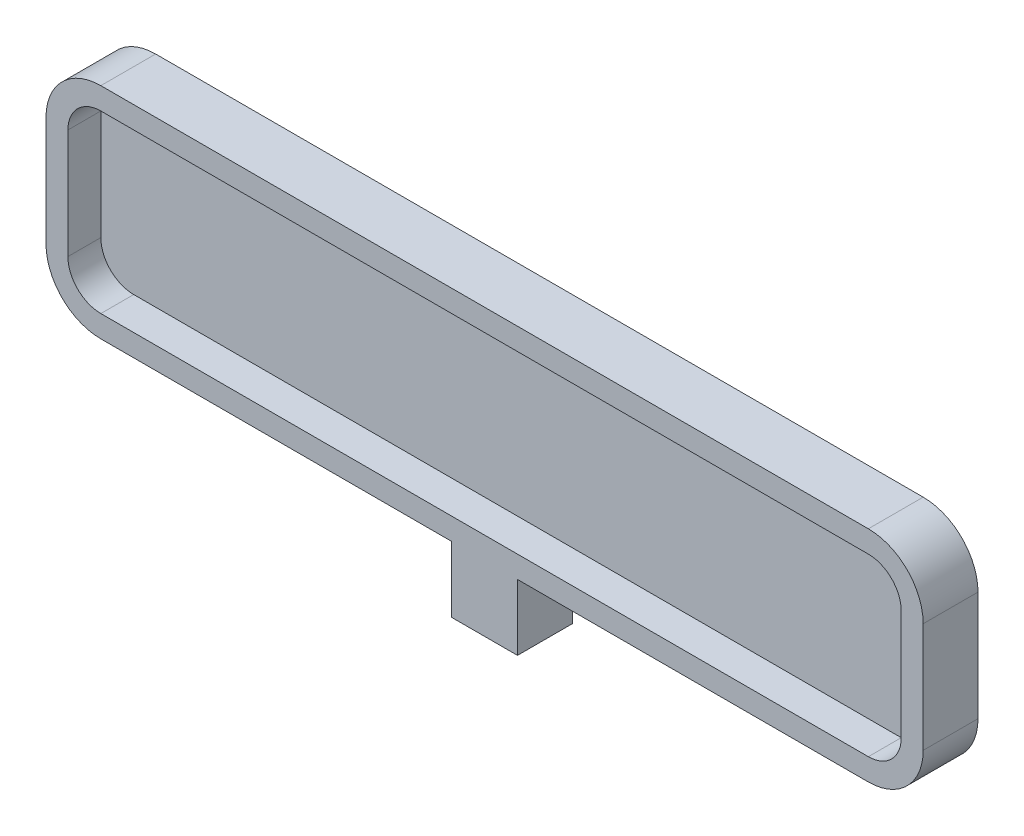
ISO-10303-21;
HEADER;
FILE_DESCRIPTION(('STEP AP214'),'2;1');
FILE_NAME('part.step','',(''),(''),'','','');
FILE_SCHEMA(('AUTOMOTIVE_DESIGN { 1 0 10303 214 1 1 1 1 }'));
ENDSEC;
DATA;
#1=APPLICATION_CONTEXT('core data for automotive mechanical design processes');
#2=APPLICATION_PROTOCOL_DEFINITION('international standard','automotive_design',2000,#1);
#3=PRODUCT_CONTEXT('',#1,'mechanical');
#4=PRODUCT('Part','Part','',(#3));
#5=PRODUCT_RELATED_PRODUCT_CATEGORY('part','',(#4));
#6=PRODUCT_DEFINITION_FORMATION('','',#4);
#7=PRODUCT_DEFINITION_CONTEXT('part definition',#1,'design');
#8=PRODUCT_DEFINITION('design','',#6,#7);
#9=PRODUCT_DEFINITION_SHAPE('','',#8);
#10=(LENGTH_UNIT() NAMED_UNIT(*) SI_UNIT(.MILLI.,.METRE.));
#11=(NAMED_UNIT(*) PLANE_ANGLE_UNIT() SI_UNIT($,.RADIAN.));
#12=(NAMED_UNIT(*) SI_UNIT($,.STERADIAN.) SOLID_ANGLE_UNIT());
#13=UNCERTAINTY_MEASURE_WITH_UNIT(LENGTH_MEASURE(1.E-05),#10,'distance_accuracy_value','');
#14=(GEOMETRIC_REPRESENTATION_CONTEXT(3) GLOBAL_UNCERTAINTY_ASSIGNED_CONTEXT((#13)) GLOBAL_UNIT_ASSIGNED_CONTEXT((#10,
#11,#12)) REPRESENTATION_CONTEXT('',''));
#15=CARTESIAN_POINT('',(0.,0.,0.));
#16=DIRECTION('',(0.,0.,1.));
#17=DIRECTION('',(1.,0.,0.));
#18=AXIS2_PLACEMENT_3D('',#15,#16,#17);
#19=CARTESIAN_POINT('',(-40.,-10.,2.5));
#20=DIRECTION('',(0.,1.,0.));
#21=DIRECTION('',(0.,0.,1.));
#22=AXIS2_PLACEMENT_3D('',#19,#20,#21);
#23=PLANE('',#22);
#24=DIRECTION('',(0.,0.,1.));
#25=VECTOR('',#24,1.);
#26=CARTESIAN_POINT('',(3.,-10.,-2.5));
#27=LINE('',#26,#25);
#28=CARTESIAN_POINT('',(3.,-10.,-2.5));
#29=VERTEX_POINT('',#28);
#30=CARTESIAN_POINT('',(3.,-10.,2.5));
#31=VERTEX_POINT('',#30);
#32=EDGE_CURVE('E199',#29,#31,#27,.T.);
#33=ORIENTED_EDGE('',*,*,#32,.F.);
#34=DIRECTION('',(1.,0.,0.));
#35=VECTOR('',#34,1.);
#36=CARTESIAN_POINT('',(-40.,-10.,-2.5));
#37=LINE('',#36,#35);
#38=CARTESIAN_POINT('',(35.,-10.,-2.5));
#39=VERTEX_POINT('',#38);
#40=EDGE_CURVE('E286',#29,#39,#37,.T.);
#41=ORIENTED_EDGE('',*,*,#40,.T.);
#42=DIRECTION('',(0.,0.,-1.));
#43=VECTOR('',#42,1.);
#44=CARTESIAN_POINT('',(35.,-10.,2.5));
#45=LINE('',#44,#43);
#46=CARTESIAN_POINT('',(35.,-10.,2.5));
#47=VERTEX_POINT('',#46);
#48=EDGE_CURVE('E277',#39,#47,#45,.F.);
#49=ORIENTED_EDGE('',*,*,#48,.T.);
#50=DIRECTION('',(1.,0.,0.));
#51=VECTOR('',#50,1.);
#52=CARTESIAN_POINT('',(-40.,-10.,2.5));
#53=LINE('',#52,#51);
#54=EDGE_CURVE('E53',#31,#47,#53,.T.);
#55=ORIENTED_EDGE('',*,*,#54,.F.);
#56=EDGE_LOOP('',(#33,#41,#49,#55));
#57=FACE_BOUND('',#56,.T.);
#58=ADVANCED_FACE('F38',(#57),#23,.F.);
#59=DIRECTION('',(0.,0.,-1.));
#60=VECTOR('',#59,1.);
#61=CARTESIAN_POINT('',(-3.,-10.,-2.5));
#62=LINE('',#61,#60);
#63=CARTESIAN_POINT('',(-3.,-10.,2.5));
#64=VERTEX_POINT('',#63);
#65=CARTESIAN_POINT('',(-3.,-10.,-2.5));
#66=VERTEX_POINT('',#65);
#67=EDGE_CURVE('E61',#64,#66,#62,.T.);
#68=ORIENTED_EDGE('',*,*,#67,.F.);
#69=CARTESIAN_POINT('',(-35.,-10.,2.5));
#70=VERTEX_POINT('',#69);
#71=EDGE_CURVE('E275',#70,#64,#53,.T.);
#72=ORIENTED_EDGE('',*,*,#71,.F.);
#73=DIRECTION('',(0.,0.,-1.));
#74=VECTOR('',#73,1.);
#75=CARTESIAN_POINT('',(-35.,-10.,2.5));
#76=LINE('',#75,#74);
#77=CARTESIAN_POINT('',(-35.,-10.,-2.5));
#78=VERTEX_POINT('',#77);
#79=EDGE_CURVE('E289',#70,#78,#76,.T.);
#80=ORIENTED_EDGE('',*,*,#79,.T.);
#81=EDGE_CURVE('E270',#78,#66,#37,.T.);
#82=ORIENTED_EDGE('',*,*,#81,.T.);
#83=EDGE_LOOP('',(#68,#72,#80,#82));
#84=FACE_BOUND('',#83,.T.);
#85=ADVANCED_FACE('F341',(#84),#23,.F.);
#86=CARTESIAN_POINT('',(40.,-10.,2.5));
#87=DIRECTION('',(-1.,0.,0.));
#88=DIRECTION('',(0.,0.,1.));
#89=AXIS2_PLACEMENT_3D('',#86,#87,#88);
#90=PLANE('',#89);
#91=DIRECTION('',(0.,1.,0.));
#92=VECTOR('',#91,1.);
#93=CARTESIAN_POINT('',(40.,-10.,2.5));
#94=LINE('',#93,#92);
#95=CARTESIAN_POINT('',(40.,-5.,2.5));
#96=VERTEX_POINT('',#95);
#97=CARTESIAN_POINT('',(40.,5.,2.5));
#98=VERTEX_POINT('',#97);
#99=EDGE_CURVE('E266',#96,#98,#94,.T.);
#100=ORIENTED_EDGE('',*,*,#99,.F.);
#101=DIRECTION('',(0.,0.,-1.));
#102=VECTOR('',#101,1.);
#103=CARTESIAN_POINT('',(40.,-5.,2.5));
#104=LINE('',#103,#102);
#105=CARTESIAN_POINT('',(40.,-5.,-2.5));
#106=VERTEX_POINT('',#105);
#107=EDGE_CURVE('E316',#96,#106,#104,.T.);
#108=ORIENTED_EDGE('',*,*,#107,.T.);
#109=DIRECTION('',(0.,1.,0.));
#110=VECTOR('',#109,1.);
#111=CARTESIAN_POINT('',(40.,-10.,-2.5));
#112=LINE('',#111,#110);
#113=CARTESIAN_POINT('',(40.,5.,-2.5));
#114=VERTEX_POINT('',#113);
#115=EDGE_CURVE('E238',#106,#114,#112,.T.);
#116=ORIENTED_EDGE('',*,*,#115,.T.);
#117=DIRECTION('',(0.,0.,-1.));
#118=VECTOR('',#117,1.);
#119=CARTESIAN_POINT('',(40.,5.,2.5));
#120=LINE('',#119,#118);
#121=EDGE_CURVE('E314',#114,#98,#120,.F.);
#122=ORIENTED_EDGE('',*,*,#121,.T.);
#123=EDGE_LOOP('',(#100,#108,#116,#122));
#124=FACE_BOUND('',#123,.T.);
#125=ADVANCED_FACE('F359',(#124),#90,.F.);
#126=CARTESIAN_POINT('',(-40.,10.,2.5));
#127=DIRECTION('',(0.,-1.,0.));
#128=DIRECTION('',(0.,0.,-1.));
#129=AXIS2_PLACEMENT_3D('',#126,#127,#128);
#130=PLANE('',#129);
#131=DIRECTION('',(-1.,0.,0.));
#132=VECTOR('',#131,1.);
#133=CARTESIAN_POINT('',(-40.,10.,2.5));
#134=LINE('',#133,#132);
#135=CARTESIAN_POINT('',(35.,10.,2.5));
#136=VERTEX_POINT('',#135);
#137=CARTESIAN_POINT('',(-35.,10.,2.5));
#138=VERTEX_POINT('',#137);
#139=EDGE_CURVE('E269',#136,#138,#134,.T.);
#140=ORIENTED_EDGE('',*,*,#139,.F.);
#141=DIRECTION('',(0.,0.,-1.));
#142=VECTOR('',#141,1.);
#143=CARTESIAN_POINT('',(35.,10.,2.5));
#144=LINE('',#143,#142);
#145=CARTESIAN_POINT('',(35.,10.,-2.5));
#146=VERTEX_POINT('',#145);
#147=EDGE_CURVE('E11',#136,#146,#144,.T.);
#148=ORIENTED_EDGE('',*,*,#147,.T.);
#149=DIRECTION('',(-1.,0.,0.));
#150=VECTOR('',#149,1.);
#151=CARTESIAN_POINT('',(-40.,10.,-2.5));
#152=LINE('',#151,#150);
#153=CARTESIAN_POINT('',(-35.,10.,-2.5));
#154=VERTEX_POINT('',#153);
#155=EDGE_CURVE('E280',#146,#154,#152,.T.);
#156=ORIENTED_EDGE('',*,*,#155,.T.);
#157=DIRECTION('',(0.,0.,-1.));
#158=VECTOR('',#157,1.);
#159=CARTESIAN_POINT('',(-35.,10.,2.5));
#160=LINE('',#159,#158);
#161=EDGE_CURVE('E46',#154,#138,#160,.F.);
#162=ORIENTED_EDGE('',*,*,#161,.T.);
#163=EDGE_LOOP('',(#140,#148,#156,#162));
#164=FACE_BOUND('',#163,.T.);
#165=ADVANCED_FACE('F321',(#164),#130,.F.);
#166=CARTESIAN_POINT('',(-40.,-10.,2.5));
#167=DIRECTION('',(1.,0.,0.));
#168=DIRECTION('',(0.,0.,-1.));
#169=AXIS2_PLACEMENT_3D('',#166,#167,#168);
#170=PLANE('',#169);
#171=DIRECTION('',(0.,-1.,0.));
#172=VECTOR('',#171,1.);
#173=CARTESIAN_POINT('',(-40.,-10.,-2.5));
#174=LINE('',#173,#172);
#175=CARTESIAN_POINT('',(-40.,5.,-2.5));
#176=VERTEX_POINT('',#175);
#177=CARTESIAN_POINT('',(-40.,-5.,-2.5));
#178=VERTEX_POINT('',#177);
#179=EDGE_CURVE('E283',#176,#178,#174,.T.);
#180=ORIENTED_EDGE('',*,*,#179,.T.);
#181=DIRECTION('',(0.,0.,-1.));
#182=VECTOR('',#181,1.);
#183=CARTESIAN_POINT('',(-40.,-5.,2.5));
#184=LINE('',#183,#182);
#185=CARTESIAN_POINT('',(-40.,-5.,2.5));
#186=VERTEX_POINT('',#185);
#187=EDGE_CURVE('E304',#178,#186,#184,.F.);
#188=ORIENTED_EDGE('',*,*,#187,.T.);
#189=DIRECTION('',(0.,-1.,0.));
#190=VECTOR('',#189,1.);
#191=CARTESIAN_POINT('',(-40.,-10.,2.5));
#192=LINE('',#191,#190);
#193=CARTESIAN_POINT('',(-40.,5.,2.5));
#194=VERTEX_POINT('',#193);
#195=EDGE_CURVE('E273',#194,#186,#192,.T.);
#196=ORIENTED_EDGE('',*,*,#195,.F.);
#197=DIRECTION('',(0.,0.,-1.));
#198=VECTOR('',#197,1.);
#199=CARTESIAN_POINT('',(-40.,5.,2.5));
#200=LINE('',#199,#198);
#201=EDGE_CURVE('E301',#194,#176,#200,.T.);
#202=ORIENTED_EDGE('',*,*,#201,.T.);
#203=EDGE_LOOP('',(#180,#188,#196,#202));
#204=FACE_BOUND('',#203,.T.);
#205=ADVANCED_FACE('F331',(#204),#170,.F.);
#206=CARTESIAN_POINT('',(0.,0.,2.5));
#207=DIRECTION('',(0.,0.,-1.));
#208=DIRECTION('',(-1.,0.,0.));
#209=AXIS2_PLACEMENT_3D('',#206,#207,#208);
#210=PLANE('',#209);
#211=DIRECTION('',(0.,-1.,0.));
#212=VECTOR('',#211,1.);
#213=CARTESIAN_POINT('',(-38.,0.,2.5));
#214=LINE('',#213,#212);
#215=CARTESIAN_POINT('',(-38.,5.,2.5));
#216=VERTEX_POINT('',#215);
#217=CARTESIAN_POINT('',(-38.,-5.,2.5));
#218=VERTEX_POINT('',#217);
#219=EDGE_CURVE('E258',#216,#218,#214,.T.);
#220=ORIENTED_EDGE('',*,*,#219,.F.);
#221=CARTESIAN_POINT('',(-35.,5.,2.5));
#222=DIRECTION('',(0.,0.,-1.));
#223=DIRECTION('',(-1.,0.,0.));
#224=AXIS2_PLACEMENT_3D('',#221,#222,#223);
#225=CIRCLE('',#224,3.);
#226=CARTESIAN_POINT('',(-35.,8.,2.5));
#227=VERTEX_POINT('',#226);
#228=EDGE_CURVE('E245',#227,#216,#225,.F.);
#229=ORIENTED_EDGE('',*,*,#228,.F.);
#230=DIRECTION('',(-1.,0.,0.));
#231=VECTOR('',#230,1.);
#232=CARTESIAN_POINT('',(0.,8.,2.5));
#233=LINE('',#232,#231);
#234=CARTESIAN_POINT('',(35.,8.,2.5));
#235=VERTEX_POINT('',#234);
#236=EDGE_CURVE('E253',#235,#227,#233,.T.);
#237=ORIENTED_EDGE('',*,*,#236,.F.);
#238=CARTESIAN_POINT('',(35.,5.,2.5));
#239=DIRECTION('',(0.,0.,-1.));
#240=DIRECTION('',(-1.,0.,0.));
#241=AXIS2_PLACEMENT_3D('',#238,#239,#240);
#242=CIRCLE('',#241,3.);
#243=CARTESIAN_POINT('',(38.,5.,2.5));
#244=VERTEX_POINT('',#243);
#245=EDGE_CURVE('E254',#244,#235,#242,.F.);
#246=ORIENTED_EDGE('',*,*,#245,.F.);
#247=DIRECTION('',(0.,1.,0.));
#248=VECTOR('',#247,1.);
#249=CARTESIAN_POINT('',(38.,0.,2.5));
#250=LINE('',#249,#248);
#251=CARTESIAN_POINT('',(38.,-5.,2.5));
#252=VERTEX_POINT('',#251);
#253=EDGE_CURVE('E219',#252,#244,#250,.T.);
#254=ORIENTED_EDGE('',*,*,#253,.F.);
#255=CARTESIAN_POINT('',(35.,-5.,2.5));
#256=DIRECTION('',(0.,0.,-1.));
#257=DIRECTION('',(-1.,0.,0.));
#258=AXIS2_PLACEMENT_3D('',#255,#256,#257);
#259=CIRCLE('',#258,3.);
#260=CARTESIAN_POINT('',(35.,-8.,2.5));
#261=VERTEX_POINT('',#260);
#262=EDGE_CURVE('E256',#261,#252,#259,.F.);
#263=ORIENTED_EDGE('',*,*,#262,.F.);
#264=DIRECTION('',(1.,0.,0.));
#265=VECTOR('',#264,1.);
#266=CARTESIAN_POINT('',(0.,-8.,2.5));
#267=LINE('',#266,#265);
#268=CARTESIAN_POINT('',(-35.,-8.,2.5));
#269=VERTEX_POINT('',#268);
#270=EDGE_CURVE('E250',#269,#261,#267,.T.);
#271=ORIENTED_EDGE('',*,*,#270,.F.);
#272=CARTESIAN_POINT('',(-35.,-5.,2.5));
#273=DIRECTION('',(0.,0.,-1.));
#274=DIRECTION('',(-1.,0.,0.));
#275=AXIS2_PLACEMENT_3D('',#272,#273,#274);
#276=CIRCLE('',#275,3.);
#277=EDGE_CURVE('E215',#218,#269,#276,.F.);
#278=ORIENTED_EDGE('',*,*,#277,.F.);
#279=EDGE_LOOP('',(#220,#229,#237,#246,#254,#263,#271,#278));
#280=FACE_BOUND('',#279,.T.);
#281=ORIENTED_EDGE('',*,*,#195,.T.);
#282=CARTESIAN_POINT('',(-35.,-5.,2.5));
#283=DIRECTION('',(0.,0.,-1.));
#284=DIRECTION('',(-1.,0.,0.));
#285=AXIS2_PLACEMENT_3D('',#282,#283,#284);
#286=CIRCLE('',#285,5.);
#287=EDGE_CURVE('E312',#186,#70,#286,.F.);
#288=ORIENTED_EDGE('',*,*,#287,.T.);
#289=ORIENTED_EDGE('',*,*,#71,.T.);
#290=DIRECTION('',(0.,1.,0.));
#291=VECTOR('',#290,1.);
#292=CARTESIAN_POINT('',(-3.,-16.,2.5));
#293=LINE('',#292,#291);
#294=CARTESIAN_POINT('',(-3.,-16.,2.5));
#295=VERTEX_POINT('',#294);
#296=EDGE_CURVE('E184',#295,#64,#293,.T.);
#297=ORIENTED_EDGE('',*,*,#296,.F.);
#298=DIRECTION('',(-1.,0.,0.));
#299=VECTOR('',#298,1.);
#300=CARTESIAN_POINT('',(-3.,-16.,2.5));
#301=LINE('',#300,#299);
#302=CARTESIAN_POINT('',(3.,-16.,2.5));
#303=VERTEX_POINT('',#302);
#304=EDGE_CURVE('E176',#303,#295,#301,.T.);
#305=ORIENTED_EDGE('',*,*,#304,.F.);
#306=DIRECTION('',(0.,1.,0.));
#307=VECTOR('',#306,1.);
#308=CARTESIAN_POINT('',(3.,-16.,2.5));
#309=LINE('',#308,#307);
#310=EDGE_CURVE('E181',#303,#31,#309,.T.);
#311=ORIENTED_EDGE('',*,*,#310,.T.);
#312=ORIENTED_EDGE('',*,*,#54,.T.);
#313=CARTESIAN_POINT('',(35.,-5.,2.5));
#314=DIRECTION('',(0.,0.,-1.));
#315=DIRECTION('',(-1.,0.,0.));
#316=AXIS2_PLACEMENT_3D('',#313,#314,#315);
#317=CIRCLE('',#316,5.);
#318=EDGE_CURVE('E310',#47,#96,#317,.F.);
#319=ORIENTED_EDGE('',*,*,#318,.T.);
#320=ORIENTED_EDGE('',*,*,#99,.T.);
#321=CARTESIAN_POINT('',(35.,5.,2.5));
#322=DIRECTION('',(0.,0.,-1.));
#323=DIRECTION('',(-1.,0.,0.));
#324=AXIS2_PLACEMENT_3D('',#321,#322,#323);
#325=CIRCLE('',#324,5.);
#326=EDGE_CURVE('E308',#98,#136,#325,.F.);
#327=ORIENTED_EDGE('',*,*,#326,.T.);
#328=ORIENTED_EDGE('',*,*,#139,.T.);
#329=CARTESIAN_POINT('',(-35.,5.,2.5));
#330=DIRECTION('',(0.,0.,-1.));
#331=DIRECTION('',(-1.,0.,0.));
#332=AXIS2_PLACEMENT_3D('',#329,#330,#331);
#333=CIRCLE('',#332,5.);
#334=EDGE_CURVE('E306',#138,#194,#333,.F.);
#335=ORIENTED_EDGE('',*,*,#334,.T.);
#336=EDGE_LOOP('',(#281,#288,#289,#297,#305,#311,#312,#319,#320,#327,#328,#335));
#337=FACE_BOUND('',#336,.T.);
#338=ADVANCED_FACE('F179',(#280,#337),#210,.F.);
#339=CARTESIAN_POINT('',(0.,0.,-2.5));
#340=DIRECTION('',(0.,0.,-1.));
#341=DIRECTION('',(-1.,0.,0.));
#342=AXIS2_PLACEMENT_3D('',#339,#340,#341);
#343=PLANE('',#342);
#344=ORIENTED_EDGE('',*,*,#81,.F.);
#345=CARTESIAN_POINT('',(-35.,-5.,-2.5));
#346=DIRECTION('',(0.,0.,-1.));
#347=DIRECTION('',(-1.,0.,0.));
#348=AXIS2_PLACEMENT_3D('',#345,#346,#347);
#349=CIRCLE('',#348,5.);
#350=EDGE_CURVE('E299',#78,#178,#349,.T.);
#351=ORIENTED_EDGE('',*,*,#350,.T.);
#352=ORIENTED_EDGE('',*,*,#179,.F.);
#353=CARTESIAN_POINT('',(-35.,5.,-2.5));
#354=DIRECTION('',(0.,0.,-1.));
#355=DIRECTION('',(-1.,0.,0.));
#356=AXIS2_PLACEMENT_3D('',#353,#354,#355);
#357=CIRCLE('',#356,5.);
#358=EDGE_CURVE('E292',#176,#154,#357,.T.);
#359=ORIENTED_EDGE('',*,*,#358,.T.);
#360=ORIENTED_EDGE('',*,*,#155,.F.);
#361=CARTESIAN_POINT('',(35.,5.,-2.5));
#362=DIRECTION('',(0.,0.,-1.));
#363=DIRECTION('',(-1.,0.,0.));
#364=AXIS2_PLACEMENT_3D('',#361,#362,#363);
#365=CIRCLE('',#364,5.);
#366=EDGE_CURVE('E294',#146,#114,#365,.T.);
#367=ORIENTED_EDGE('',*,*,#366,.T.);
#368=ORIENTED_EDGE('',*,*,#115,.F.);
#369=CARTESIAN_POINT('',(35.,-5.,-2.5));
#370=DIRECTION('',(0.,0.,-1.));
#371=DIRECTION('',(-1.,0.,0.));
#372=AXIS2_PLACEMENT_3D('',#369,#370,#371);
#373=CIRCLE('',#372,5.);
#374=EDGE_CURVE('E296',#106,#39,#373,.T.);
#375=ORIENTED_EDGE('',*,*,#374,.T.);
#376=ORIENTED_EDGE('',*,*,#40,.F.);
#377=DIRECTION('',(0.,1.,0.));
#378=VECTOR('',#377,1.);
#379=CARTESIAN_POINT('',(3.,-16.,-2.5));
#380=LINE('',#379,#378);
#381=CARTESIAN_POINT('',(3.,-16.,-2.5));
#382=VERTEX_POINT('',#381);
#383=EDGE_CURVE('E346',#382,#29,#380,.T.);
#384=ORIENTED_EDGE('',*,*,#383,.F.);
#385=DIRECTION('',(1.,0.,0.));
#386=VECTOR('',#385,1.);
#387=CARTESIAN_POINT('',(-3.,-16.,-2.5));
#388=LINE('',#387,#386);
#389=CARTESIAN_POINT('',(-3.,-16.,-2.5));
#390=VERTEX_POINT('',#389);
#391=EDGE_CURVE('E193',#390,#382,#388,.T.);
#392=ORIENTED_EDGE('',*,*,#391,.F.);
#393=DIRECTION('',(0.,1.,0.));
#394=VECTOR('',#393,1.);
#395=CARTESIAN_POINT('',(-3.,-16.,-2.5));
#396=LINE('',#395,#394);
#397=EDGE_CURVE('E205',#390,#66,#396,.T.);
#398=ORIENTED_EDGE('',*,*,#397,.T.);
#399=EDGE_LOOP('',(#344,#351,#352,#359,#360,#367,#368,#375,#376,#384,#392,#398));
#400=FACE_BOUND('',#399,.T.);
#401=ADVANCED_FACE('F335',(#400),#343,.T.);
#402=CARTESIAN_POINT('',(-35.,-5.,2.5));
#403=DIRECTION('',(0.,0.,-1.));
#404=DIRECTION('',(-1.,0.,0.));
#405=AXIS2_PLACEMENT_3D('',#402,#403,#404);
#406=CYLINDRICAL_SURFACE('',#405,5.);
#407=ORIENTED_EDGE('',*,*,#287,.F.);
#408=ORIENTED_EDGE('',*,*,#187,.F.);
#409=ORIENTED_EDGE('',*,*,#350,.F.);
#410=ORIENTED_EDGE('',*,*,#79,.F.);
#411=EDGE_LOOP('',(#407,#408,#409,#410));
#412=FACE_BOUND('',#411,.T.);
#413=ADVANCED_FACE('F340',(#412),#406,.T.);
#414=CARTESIAN_POINT('',(35.,-5.,2.5));
#415=DIRECTION('',(0.,0.,-1.));
#416=DIRECTION('',(-1.,0.,0.));
#417=AXIS2_PLACEMENT_3D('',#414,#415,#416);
#418=CYLINDRICAL_SURFACE('',#417,5.);
#419=ORIENTED_EDGE('',*,*,#318,.F.);
#420=ORIENTED_EDGE('',*,*,#48,.F.);
#421=ORIENTED_EDGE('',*,*,#374,.F.);
#422=ORIENTED_EDGE('',*,*,#107,.F.);
#423=EDGE_LOOP('',(#419,#420,#421,#422));
#424=FACE_BOUND('',#423,.T.);
#425=ADVANCED_FACE('F372',(#424),#418,.T.);
#426=CARTESIAN_POINT('',(35.,5.,2.5));
#427=DIRECTION('',(0.,0.,-1.));
#428=DIRECTION('',(-1.,0.,0.));
#429=AXIS2_PLACEMENT_3D('',#426,#427,#428);
#430=CYLINDRICAL_SURFACE('',#429,5.);
#431=ORIENTED_EDGE('',*,*,#326,.F.);
#432=ORIENTED_EDGE('',*,*,#121,.F.);
#433=ORIENTED_EDGE('',*,*,#366,.F.);
#434=ORIENTED_EDGE('',*,*,#147,.F.);
#435=EDGE_LOOP('',(#431,#432,#433,#434));
#436=FACE_BOUND('',#435,.T.);
#437=ADVANCED_FACE('F374',(#436),#430,.T.);
#438=CARTESIAN_POINT('',(-35.,5.,2.5));
#439=DIRECTION('',(0.,0.,-1.));
#440=DIRECTION('',(-1.,0.,0.));
#441=AXIS2_PLACEMENT_3D('',#438,#439,#440);
#442=CYLINDRICAL_SURFACE('',#441,5.);
#443=ORIENTED_EDGE('',*,*,#334,.F.);
#444=ORIENTED_EDGE('',*,*,#161,.F.);
#445=ORIENTED_EDGE('',*,*,#358,.F.);
#446=ORIENTED_EDGE('',*,*,#201,.F.);
#447=EDGE_LOOP('',(#443,#444,#445,#446));
#448=FACE_BOUND('',#447,.T.);
#449=ADVANCED_FACE('F40',(#448),#442,.T.);
#450=CARTESIAN_POINT('',(38.,-10.,2.5));
#451=DIRECTION('',(-1.,0.,0.));
#452=DIRECTION('',(0.,0.,1.));
#453=AXIS2_PLACEMENT_3D('',#450,#451,#452);
#454=PLANE('',#453);
#455=ORIENTED_EDGE('',*,*,#253,.T.);
#456=DIRECTION('',(0.,0.,1.));
#457=VECTOR('',#456,1.);
#458=CARTESIAN_POINT('',(38.,5.,2.5));
#459=LINE('',#458,#457);
#460=CARTESIAN_POINT('',(38.,5.,-0.5));
#461=VERTEX_POINT('',#460);
#462=EDGE_CURVE('E212',#461,#244,#459,.T.);
#463=ORIENTED_EDGE('',*,*,#462,.F.);
#464=DIRECTION('',(0.,1.,0.));
#465=VECTOR('',#464,1.);
#466=CARTESIAN_POINT('',(38.,0.,-0.5));
#467=LINE('',#466,#465);
#468=CARTESIAN_POINT('',(38.,-5.,-0.5));
#469=VERTEX_POINT('',#468);
#470=EDGE_CURVE('E200',#469,#461,#467,.T.);
#471=ORIENTED_EDGE('',*,*,#470,.F.);
#472=DIRECTION('',(0.,0.,1.));
#473=VECTOR('',#472,1.);
#474=CARTESIAN_POINT('',(38.,-5.,2.5));
#475=LINE('',#474,#473);
#476=EDGE_CURVE('E209',#252,#469,#475,.F.);
#477=ORIENTED_EDGE('',*,*,#476,.F.);
#478=EDGE_LOOP('',(#455,#463,#471,#477));
#479=FACE_BOUND('',#478,.T.);
#480=ADVANCED_FACE('F381',(#479),#454,.T.);
#481=CARTESIAN_POINT('',(-40.,8.,2.5));
#482=DIRECTION('',(0.,-1.,0.));
#483=DIRECTION('',(0.,0.,-1.));
#484=AXIS2_PLACEMENT_3D('',#481,#482,#483);
#485=PLANE('',#484);
#486=ORIENTED_EDGE('',*,*,#236,.T.);
#487=DIRECTION('',(0.,0.,-1.));
#488=VECTOR('',#487,1.);
#489=CARTESIAN_POINT('',(-35.,8.,2.5));
#490=LINE('',#489,#488);
#491=CARTESIAN_POINT('',(-35.,8.,-0.5));
#492=VERTEX_POINT('',#491);
#493=EDGE_CURVE('E211',#492,#227,#490,.F.);
#494=ORIENTED_EDGE('',*,*,#493,.F.);
#495=DIRECTION('',(-1.,0.,0.));
#496=VECTOR('',#495,1.);
#497=CARTESIAN_POINT('',(0.,8.,-0.5));
#498=LINE('',#497,#496);
#499=CARTESIAN_POINT('',(35.,8.,-0.5));
#500=VERTEX_POINT('',#499);
#501=EDGE_CURVE('E203',#500,#492,#498,.T.);
#502=ORIENTED_EDGE('',*,*,#501,.F.);
#503=DIRECTION('',(0.,0.,-1.));
#504=VECTOR('',#503,1.);
#505=CARTESIAN_POINT('',(35.,8.,2.5));
#506=LINE('',#505,#504);
#507=EDGE_CURVE('E235',#235,#500,#506,.T.);
#508=ORIENTED_EDGE('',*,*,#507,.F.);
#509=EDGE_LOOP('',(#486,#494,#502,#508));
#510=FACE_BOUND('',#509,.T.);
#511=ADVANCED_FACE('F389',(#510),#485,.T.);
#512=CARTESIAN_POINT('',(-38.,-10.,2.5));
#513=DIRECTION('',(1.,0.,0.));
#514=DIRECTION('',(0.,0.,-1.));
#515=AXIS2_PLACEMENT_3D('',#512,#513,#514);
#516=PLANE('',#515);
#517=DIRECTION('',(0.,-1.,0.));
#518=VECTOR('',#517,1.);
#519=CARTESIAN_POINT('',(-38.,0.,-0.5));
#520=LINE('',#519,#518);
#521=CARTESIAN_POINT('',(-38.,5.,-0.5));
#522=VERTEX_POINT('',#521);
#523=CARTESIAN_POINT('',(-38.,-5.,-0.5));
#524=VERTEX_POINT('',#523);
#525=EDGE_CURVE('E220',#522,#524,#520,.T.);
#526=ORIENTED_EDGE('',*,*,#525,.F.);
#527=DIRECTION('',(0.,0.,-1.));
#528=VECTOR('',#527,1.);
#529=CARTESIAN_POINT('',(-38.,5.,2.5));
#530=LINE('',#529,#528);
#531=EDGE_CURVE('E223',#216,#522,#530,.T.);
#532=ORIENTED_EDGE('',*,*,#531,.F.);
#533=ORIENTED_EDGE('',*,*,#219,.T.);
#534=DIRECTION('',(0.,0.,-1.));
#535=VECTOR('',#534,1.);
#536=CARTESIAN_POINT('',(-38.,-5.,2.5));
#537=LINE('',#536,#535);
#538=EDGE_CURVE('E243',#524,#218,#537,.F.);
#539=ORIENTED_EDGE('',*,*,#538,.F.);
#540=EDGE_LOOP('',(#526,#532,#533,#539));
#541=FACE_BOUND('',#540,.T.);
#542=ADVANCED_FACE('F395',(#541),#516,.T.);
#543=CARTESIAN_POINT('',(-40.,-8.,2.5));
#544=DIRECTION('',(0.,1.,0.));
#545=DIRECTION('',(0.,0.,1.));
#546=AXIS2_PLACEMENT_3D('',#543,#544,#545);
#547=PLANE('',#546);
#548=ORIENTED_EDGE('',*,*,#270,.T.);
#549=DIRECTION('',(0.,0.,1.));
#550=VECTOR('',#549,1.);
#551=CARTESIAN_POINT('',(35.,-8.,2.5));
#552=LINE('',#551,#550);
#553=CARTESIAN_POINT('',(35.,-8.,-0.5));
#554=VERTEX_POINT('',#553);
#555=EDGE_CURVE('E248',#554,#261,#552,.T.);
#556=ORIENTED_EDGE('',*,*,#555,.F.);
#557=DIRECTION('',(1.,0.,0.));
#558=VECTOR('',#557,1.);
#559=CARTESIAN_POINT('',(0.,-8.,-0.5));
#560=LINE('',#559,#558);
#561=CARTESIAN_POINT('',(-35.,-8.,-0.5));
#562=VERTEX_POINT('',#561);
#563=EDGE_CURVE('E216',#562,#554,#560,.T.);
#564=ORIENTED_EDGE('',*,*,#563,.F.);
#565=DIRECTION('',(0.,0.,1.));
#566=VECTOR('',#565,1.);
#567=CARTESIAN_POINT('',(-35.,-8.,2.5));
#568=LINE('',#567,#566);
#569=EDGE_CURVE('E230',#269,#562,#568,.F.);
#570=ORIENTED_EDGE('',*,*,#569,.F.);
#571=EDGE_LOOP('',(#548,#556,#564,#570));
#572=FACE_BOUND('',#571,.T.);
#573=ADVANCED_FACE('F403',(#572),#547,.T.);
#574=CARTESIAN_POINT('',(0.,0.,-0.5));
#575=DIRECTION('',(0.,0.,-1.));
#576=DIRECTION('',(-1.,0.,0.));
#577=AXIS2_PLACEMENT_3D('',#574,#575,#576);
#578=PLANE('',#577);
#579=ORIENTED_EDGE('',*,*,#563,.T.);
#580=CARTESIAN_POINT('',(35.,-5.,-0.5));
#581=DIRECTION('',(0.,0.,-1.));
#582=DIRECTION('',(-1.,0.,0.));
#583=AXIS2_PLACEMENT_3D('',#580,#581,#582);
#584=CIRCLE('',#583,3.);
#585=EDGE_CURVE('E224',#469,#554,#584,.T.);
#586=ORIENTED_EDGE('',*,*,#585,.F.);
#587=ORIENTED_EDGE('',*,*,#470,.T.);
#588=CARTESIAN_POINT('',(35.,5.,-0.5));
#589=DIRECTION('',(0.,0.,-1.));
#590=DIRECTION('',(-1.,0.,0.));
#591=AXIS2_PLACEMENT_3D('',#588,#589,#590);
#592=CIRCLE('',#591,3.);
#593=EDGE_CURVE('E229',#500,#461,#592,.T.);
#594=ORIENTED_EDGE('',*,*,#593,.F.);
#595=ORIENTED_EDGE('',*,*,#501,.T.);
#596=CARTESIAN_POINT('',(-35.,5.,-0.5));
#597=DIRECTION('',(0.,0.,-1.));
#598=DIRECTION('',(-1.,0.,0.));
#599=AXIS2_PLACEMENT_3D('',#596,#597,#598);
#600=CIRCLE('',#599,3.);
#601=EDGE_CURVE('E227',#522,#492,#600,.T.);
#602=ORIENTED_EDGE('',*,*,#601,.F.);
#603=ORIENTED_EDGE('',*,*,#525,.T.);
#604=CARTESIAN_POINT('',(-35.,-5.,-0.5));
#605=DIRECTION('',(0.,0.,-1.));
#606=DIRECTION('',(-1.,0.,0.));
#607=AXIS2_PLACEMENT_3D('',#604,#605,#606);
#608=CIRCLE('',#607,3.);
#609=EDGE_CURVE('E221',#562,#524,#608,.T.);
#610=ORIENTED_EDGE('',*,*,#609,.F.);
#611=EDGE_LOOP('',(#579,#586,#587,#594,#595,#602,#603,#610));
#612=FACE_BOUND('',#611,.T.);
#613=ADVANCED_FACE('F407',(#612),#578,.F.);
#614=CARTESIAN_POINT('',(-35.,-5.,2.5));
#615=DIRECTION('',(0.,0.,-1.));
#616=DIRECTION('',(-1.,0.,0.));
#617=AXIS2_PLACEMENT_3D('',#614,#615,#616);
#618=CYLINDRICAL_SURFACE('',#617,3.);
#619=ORIENTED_EDGE('',*,*,#277,.T.);
#620=ORIENTED_EDGE('',*,*,#569,.T.);
#621=ORIENTED_EDGE('',*,*,#609,.T.);
#622=ORIENTED_EDGE('',*,*,#538,.T.);
#623=EDGE_LOOP('',(#619,#620,#621,#622));
#624=FACE_BOUND('',#623,.T.);
#625=ADVANCED_FACE('F411',(#624),#618,.F.);
#626=CARTESIAN_POINT('',(35.,-5.,2.5));
#627=DIRECTION('',(0.,0.,-1.));
#628=DIRECTION('',(-1.,0.,0.));
#629=AXIS2_PLACEMENT_3D('',#626,#627,#628);
#630=CYLINDRICAL_SURFACE('',#629,3.);
#631=ORIENTED_EDGE('',*,*,#262,.T.);
#632=ORIENTED_EDGE('',*,*,#476,.T.);
#633=ORIENTED_EDGE('',*,*,#585,.T.);
#634=ORIENTED_EDGE('',*,*,#555,.T.);
#635=EDGE_LOOP('',(#631,#632,#633,#634));
#636=FACE_BOUND('',#635,.T.);
#637=ADVANCED_FACE('F415',(#636),#630,.F.);
#638=CARTESIAN_POINT('',(35.,5.,2.5));
#639=DIRECTION('',(0.,0.,-1.));
#640=DIRECTION('',(-1.,0.,0.));
#641=AXIS2_PLACEMENT_3D('',#638,#639,#640);
#642=CYLINDRICAL_SURFACE('',#641,3.);
#643=ORIENTED_EDGE('',*,*,#245,.T.);
#644=ORIENTED_EDGE('',*,*,#507,.T.);
#645=ORIENTED_EDGE('',*,*,#593,.T.);
#646=ORIENTED_EDGE('',*,*,#462,.T.);
#647=EDGE_LOOP('',(#643,#644,#645,#646));
#648=FACE_BOUND('',#647,.T.);
#649=ADVANCED_FACE('F419',(#648),#642,.F.);
#650=CARTESIAN_POINT('',(-35.,5.,2.5));
#651=DIRECTION('',(0.,0.,-1.));
#652=DIRECTION('',(-1.,0.,0.));
#653=AXIS2_PLACEMENT_3D('',#650,#651,#652);
#654=CYLINDRICAL_SURFACE('',#653,3.);
#655=ORIENTED_EDGE('',*,*,#228,.T.);
#656=ORIENTED_EDGE('',*,*,#531,.T.);
#657=ORIENTED_EDGE('',*,*,#601,.T.);
#658=ORIENTED_EDGE('',*,*,#493,.T.);
#659=EDGE_LOOP('',(#655,#656,#657,#658));
#660=FACE_BOUND('',#659,.T.);
#661=ADVANCED_FACE('F423',(#660),#654,.F.);
#662=CARTESIAN_POINT('',(3.,-16.,-2.5));
#663=DIRECTION('',(-1.,0.,0.));
#664=DIRECTION('',(0.,0.,1.));
#665=AXIS2_PLACEMENT_3D('',#662,#663,#664);
#666=PLANE('',#665);
#667=ORIENTED_EDGE('',*,*,#32,.T.);
#668=ORIENTED_EDGE('',*,*,#310,.F.);
#669=DIRECTION('',(0.,0.,1.));
#670=VECTOR('',#669,1.);
#671=CARTESIAN_POINT('',(3.,-16.,-2.5));
#672=LINE('',#671,#670);
#673=EDGE_CURVE('E188',#382,#303,#672,.T.);
#674=ORIENTED_EDGE('',*,*,#673,.F.);
#675=ORIENTED_EDGE('',*,*,#383,.T.);
#676=EDGE_LOOP('',(#667,#668,#674,#675));
#677=FACE_BOUND('',#676,.T.);
#678=ADVANCED_FACE('F198',(#677),#666,.F.);
#679=CARTESIAN_POINT('',(-3.,-16.,-2.5));
#680=DIRECTION('',(1.,0.,0.));
#681=DIRECTION('',(0.,0.,-1.));
#682=AXIS2_PLACEMENT_3D('',#679,#680,#681);
#683=PLANE('',#682);
#684=ORIENTED_EDGE('',*,*,#67,.T.);
#685=ORIENTED_EDGE('',*,*,#397,.F.);
#686=DIRECTION('',(0.,0.,-1.));
#687=VECTOR('',#686,1.);
#688=CARTESIAN_POINT('',(-3.,-16.,-2.5));
#689=LINE('',#688,#687);
#690=EDGE_CURVE('E187',#295,#390,#689,.T.);
#691=ORIENTED_EDGE('',*,*,#690,.F.);
#692=ORIENTED_EDGE('',*,*,#296,.T.);
#693=EDGE_LOOP('',(#684,#685,#691,#692));
#694=FACE_BOUND('',#693,.T.);
#695=ADVANCED_FACE('F343',(#694),#683,.F.);
#696=CARTESIAN_POINT('',(0.,-16.,0.));
#697=DIRECTION('',(0.,1.,0.));
#698=DIRECTION('',(0.,0.,1.));
#699=AXIS2_PLACEMENT_3D('',#696,#697,#698);
#700=PLANE('',#699);
#701=CARTESIAN_POINT('',(0.,-16.,0.));
#702=DIRECTION('',(0.,-1.,0.));
#703=DIRECTION('',(0.,0.,-1.));
#704=AXIS2_PLACEMENT_3D('',#701,#702,#703);
#705=CIRCLE('',#704,1.425);
#706=CARTESIAN_POINT('',(0.,-16.,-1.425));
#707=VERTEX_POINT('',#706);
#708=EDGE_CURVE('E595',#707,#707,#705,.T.);
#709=ORIENTED_EDGE('',*,*,#708,.F.);
#710=EDGE_LOOP('',(#709));
#711=FACE_BOUND('',#710,.T.);
#712=ORIENTED_EDGE('',*,*,#673,.T.);
#713=ORIENTED_EDGE('',*,*,#304,.T.);
#714=ORIENTED_EDGE('',*,*,#690,.T.);
#715=ORIENTED_EDGE('',*,*,#391,.T.);
#716=EDGE_LOOP('',(#712,#713,#714,#715));
#717=FACE_BOUND('',#716,.T.);
#718=ADVANCED_FACE('F191',(#711,#717),#700,.F.);
#719=CARTESIAN_POINT('',(0.,-12.,0.));
#720=DIRECTION('',(0.,-1.,0.));
#721=DIRECTION('',(0.,0.,-1.));
#722=AXIS2_PLACEMENT_3D('',#719,#720,#721);
#723=CYLINDRICAL_SURFACE('',#722,1.425);
#724=CARTESIAN_POINT('',(0.,-12.,0.));
#725=DIRECTION('',(0.,-1.,0.));
#726=DIRECTION('',(0.,0.,-1.));
#727=AXIS2_PLACEMENT_3D('',#724,#725,#726);
#728=CIRCLE('',#727,1.425);
#729=CARTESIAN_POINT('',(0.,-12.,-1.425));
#730=VERTEX_POINT('',#729);
#731=EDGE_CURVE('E350',#730,#730,#728,.T.);
#732=ORIENTED_EDGE('',*,*,#731,.F.);
#733=EDGE_LOOP('',(#732));
#734=FACE_BOUND('',#733,.T.);
#735=ORIENTED_EDGE('',*,*,#708,.T.);
#736=EDGE_LOOP('',(#735));
#737=FACE_BOUND('',#736,.T.);
#738=ADVANCED_FACE('F568',(#734,#737),#723,.F.);
#739=CARTESIAN_POINT('',(0.,-12.,0.));
#740=DIRECTION('',(0.,-1.,0.));
#741=DIRECTION('',(0.,0.,-1.));
#742=AXIS2_PLACEMENT_3D('',#739,#740,#741);
#743=PLANE('',#742);
#744=ORIENTED_EDGE('',*,*,#731,.T.);
#745=EDGE_LOOP('',(#744));
#746=FACE_BOUND('',#745,.T.);
#747=ADVANCED_FACE('F577',(#746),#743,.T.);
#748=CLOSED_SHELL('',(#58,#85,#125,#165,#205,#338,#401,#413,#425,#437,#449,#480,#511,#542,#573,
#613,#625,#637,#649,#661,#678,#695,#718,#738,#747));
#749=MANIFOLD_SOLID_BREP('B2',#748);
#750=ADVANCED_BREP_SHAPE_REPRESENTATION('',(#18,#749),#14);
#751=SHAPE_DEFINITION_REPRESENTATION(#9,#750);
ENDSEC;
END-ISO-10303-21;
